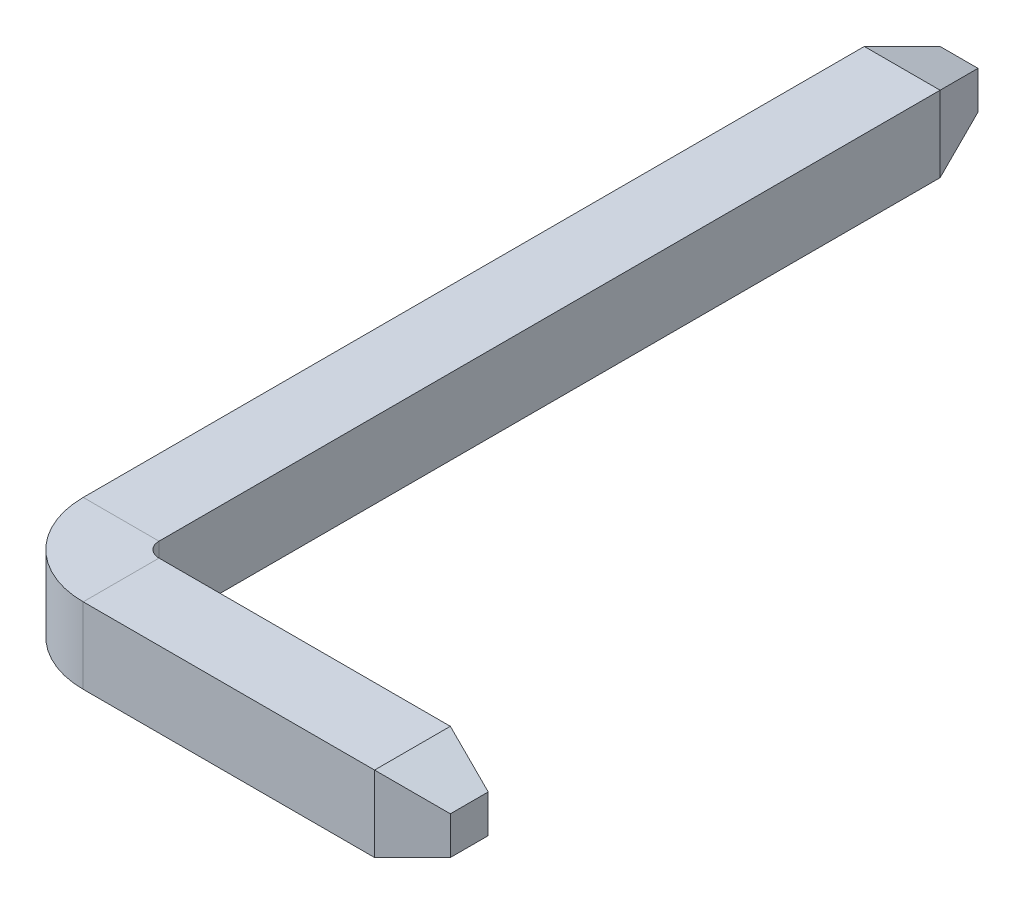
ISO-10303-21;
HEADER;
FILE_DESCRIPTION(('STEP AP214'),'2;1');
FILE_NAME('part.step','',(''),(''),'','','');
FILE_SCHEMA(('AUTOMOTIVE_DESIGN { 1 0 10303 214 1 1 1 1 }'));
ENDSEC;
DATA;
#1=APPLICATION_CONTEXT('core data for automotive mechanical design processes');
#2=APPLICATION_PROTOCOL_DEFINITION('international standard','automotive_design',2000,#1);
#3=PRODUCT_CONTEXT('',#1,'mechanical');
#4=PRODUCT('Part','Part','',(#3));
#5=PRODUCT_RELATED_PRODUCT_CATEGORY('part','',(#4));
#6=PRODUCT_DEFINITION_FORMATION('','',#4);
#7=PRODUCT_DEFINITION_CONTEXT('part definition',#1,'design');
#8=PRODUCT_DEFINITION('design','',#6,#7);
#9=PRODUCT_DEFINITION_SHAPE('','',#8);
#10=(LENGTH_UNIT() NAMED_UNIT(*) SI_UNIT(.MILLI.,.METRE.));
#11=(NAMED_UNIT(*) PLANE_ANGLE_UNIT() SI_UNIT($,.RADIAN.));
#12=(NAMED_UNIT(*) SI_UNIT($,.STERADIAN.) SOLID_ANGLE_UNIT());
#13=UNCERTAINTY_MEASURE_WITH_UNIT(LENGTH_MEASURE(1.E-05),#10,'distance_accuracy_value','');
#14=(GEOMETRIC_REPRESENTATION_CONTEXT(3) GLOBAL_UNCERTAINTY_ASSIGNED_CONTEXT((#13)) GLOBAL_UNIT_ASSIGNED_CONTEXT((#10,
#11,#12)) REPRESENTATION_CONTEXT('',''));
#15=CARTESIAN_POINT('',(0.,0.,0.));
#16=DIRECTION('',(0.,0.,1.));
#17=DIRECTION('',(1.,0.,0.));
#18=AXIS2_PLACEMENT_3D('',#15,#16,#17);
#19=CARTESIAN_POINT('',(0.4773820618069,-0.2,0.));
#20=DIRECTION('',(0.,0.,1.));
#21=DIRECTION('',(1.,0.,0.));
#22=AXIS2_PLACEMENT_3D('',#19,#20,#21);
#23=PLANE('',#22);
#24=DIRECTION('',(1.,0.,0.));
#25=VECTOR('',#24,1.);
#26=CARTESIAN_POINT('',(0.4773820618069,0.2,0.));
#27=LINE('',#26,#25);
#28=CARTESIAN_POINT('',(0.4773820618069,0.2,0.));
#29=VERTEX_POINT('',#28);
#30=CARTESIAN_POINT('',(2.015,0.2,0.));
#31=VERTEX_POINT('',#30);
#32=EDGE_CURVE('E11',#29,#31,#27,.T.);
#33=ORIENTED_EDGE('',*,*,#32,.F.);
#34=DIRECTION('',(0.,1.,0.));
#35=VECTOR('',#34,1.);
#36=CARTESIAN_POINT('',(0.4773820618069,-0.2,0.));
#37=LINE('',#36,#35);
#38=CARTESIAN_POINT('',(0.4773820618069,-0.2,0.));
#39=VERTEX_POINT('',#38);
#40=EDGE_CURVE('E24',#39,#29,#37,.T.);
#41=ORIENTED_EDGE('',*,*,#40,.F.);
#42=DIRECTION('',(1.,0.,0.));
#43=VECTOR('',#42,1.);
#44=CARTESIAN_POINT('',(0.4773820618069,-0.2,0.));
#45=LINE('',#44,#43);
#46=CARTESIAN_POINT('',(2.015,-0.2,0.));
#47=VERTEX_POINT('',#46);
#48=EDGE_CURVE('E232',#39,#47,#45,.T.);
#49=ORIENTED_EDGE('',*,*,#48,.T.);
#50=DIRECTION('',(0.,-1.,0.));
#51=VECTOR('',#50,1.);
#52=CARTESIAN_POINT('',(2.015,0.2,0.));
#53=LINE('',#52,#51);
#54=EDGE_CURVE('E37',#31,#47,#53,.T.);
#55=ORIENTED_EDGE('',*,*,#54,.F.);
#56=EDGE_LOOP('',(#33,#41,#49,#55));
#57=FACE_BOUND('',#56,.T.);
#58=ADVANCED_FACE('F17',(#57),#23,.T.);
#59=CARTESIAN_POINT('',(2.165,0.,-0.05));
#60=DIRECTION('',(0.316227766016808,0.,0.948683298050524));
#61=DIRECTION('',(0.,-1.,0.));
#62=AXIS2_PLACEMENT_3D('',#59,#60,#61);
#63=PLANE('',#62);
#64=DIRECTION('',(-0.904534033733273,-0.301511344577791,0.301511344577791));
#65=VECTOR('',#64,1.);
#66=CARTESIAN_POINT('',(2.315,-0.1,-0.1));
#67=LINE('',#66,#65);
#68=CARTESIAN_POINT('',(2.315,-0.1,-0.1));
#69=VERTEX_POINT('',#68);
#70=EDGE_CURVE('E228',#69,#47,#67,.T.);
#71=ORIENTED_EDGE('',*,*,#70,.F.);
#72=DIRECTION('',(0.,-1.,0.));
#73=VECTOR('',#72,1.);
#74=CARTESIAN_POINT('',(2.315,0.1,-0.1));
#75=LINE('',#74,#73);
#76=CARTESIAN_POINT('',(2.315,0.1,-0.1));
#77=VERTEX_POINT('',#76);
#78=EDGE_CURVE('E226',#77,#69,#75,.T.);
#79=ORIENTED_EDGE('',*,*,#78,.F.);
#80=DIRECTION('',(-0.904534033733273,0.301511344577791,0.301511344577791));
#81=VECTOR('',#80,1.);
#82=CARTESIAN_POINT('',(2.315,0.1,-0.1));
#83=LINE('',#82,#81);
#84=EDGE_CURVE('E223',#77,#31,#83,.T.);
#85=ORIENTED_EDGE('',*,*,#84,.T.);
#86=ORIENTED_EDGE('',*,*,#54,.T.);
#87=EDGE_LOOP('',(#71,#79,#85,#86));
#88=FACE_BOUND('',#87,.T.);
#89=ADVANCED_FACE('F252',(#88),#63,.T.);
#90=CARTESIAN_POINT('',(2.165,0.15,-0.2));
#91=DIRECTION('',(0.316227766016808,0.948683298050524,0.));
#92=DIRECTION('',(0.,0.,-1.));
#93=AXIS2_PLACEMENT_3D('',#90,#91,#92);
#94=PLANE('',#93);
#95=DIRECTION('',(-0.904534033733273,0.301511344577791,-0.301511344577791));
#96=VECTOR('',#95,1.);
#97=CARTESIAN_POINT('',(2.315,0.1,-0.3));
#98=LINE('',#97,#96);
#99=CARTESIAN_POINT('',(2.315,0.1,-0.3));
#100=VERTEX_POINT('',#99);
#101=CARTESIAN_POINT('',(2.015,0.2,-0.4));
#102=VERTEX_POINT('',#101);
#103=EDGE_CURVE('E220',#100,#102,#98,.T.);
#104=ORIENTED_EDGE('',*,*,#103,.T.);
#105=DIRECTION('',(0.,0.,1.));
#106=VECTOR('',#105,1.);
#107=CARTESIAN_POINT('',(2.015,0.2,-0.4));
#108=LINE('',#107,#106);
#109=EDGE_CURVE('E217',#102,#31,#108,.T.);
#110=ORIENTED_EDGE('',*,*,#109,.T.);
#111=ORIENTED_EDGE('',*,*,#84,.F.);
#112=DIRECTION('',(0.,0.,1.));
#113=VECTOR('',#112,1.);
#114=CARTESIAN_POINT('',(2.315,0.1,-0.3));
#115=LINE('',#114,#113);
#116=EDGE_CURVE('E214',#100,#77,#115,.T.);
#117=ORIENTED_EDGE('',*,*,#116,.F.);
#118=EDGE_LOOP('',(#104,#110,#111,#117));
#119=FACE_BOUND('',#118,.T.);
#120=ADVANCED_FACE('F254',(#119),#94,.T.);
#121=CARTESIAN_POINT('',(2.315,0.,-0.2));
#122=DIRECTION('',(1.,0.,0.));
#123=DIRECTION('',(0.,1.,0.));
#124=AXIS2_PLACEMENT_3D('',#121,#122,#123);
#125=PLANE('',#124);
#126=ORIENTED_EDGE('',*,*,#78,.T.);
#127=DIRECTION('',(0.,0.,1.));
#128=VECTOR('',#127,1.);
#129=CARTESIAN_POINT('',(2.315,-0.1,-0.3));
#130=LINE('',#129,#128);
#131=CARTESIAN_POINT('',(2.315,-0.1,-0.3));
#132=VERTEX_POINT('',#131);
#133=EDGE_CURVE('E211',#132,#69,#130,.T.);
#134=ORIENTED_EDGE('',*,*,#133,.F.);
#135=DIRECTION('',(0.,1.,0.));
#136=VECTOR('',#135,1.);
#137=CARTESIAN_POINT('',(2.315,-0.1,-0.3));
#138=LINE('',#137,#136);
#139=EDGE_CURVE('E208',#132,#100,#138,.T.);
#140=ORIENTED_EDGE('',*,*,#139,.T.);
#141=ORIENTED_EDGE('',*,*,#116,.T.);
#142=EDGE_LOOP('',(#126,#134,#140,#141));
#143=FACE_BOUND('',#142,.T.);
#144=ADVANCED_FACE('F251',(#143),#125,.T.);
#145=CARTESIAN_POINT('',(2.165,0.,-0.35));
#146=DIRECTION('',(0.316227766016808,0.,-0.948683298050524));
#147=DIRECTION('',(0.,-1.,0.));
#148=AXIS2_PLACEMENT_3D('',#145,#146,#147);
#149=PLANE('',#148);
#150=ORIENTED_EDGE('',*,*,#103,.F.);
#151=ORIENTED_EDGE('',*,*,#139,.F.);
#152=DIRECTION('',(-0.904534033733273,-0.301511344577791,-0.301511344577791));
#153=VECTOR('',#152,1.);
#154=CARTESIAN_POINT('',(2.315,-0.1,-0.3));
#155=LINE('',#154,#153);
#156=CARTESIAN_POINT('',(2.015,-0.2,-0.4));
#157=VERTEX_POINT('',#156);
#158=EDGE_CURVE('E205',#132,#157,#155,.T.);
#159=ORIENTED_EDGE('',*,*,#158,.T.);
#160=DIRECTION('',(0.,1.,0.));
#161=VECTOR('',#160,1.);
#162=CARTESIAN_POINT('',(2.015,-0.2,-0.4));
#163=LINE('',#162,#161);
#164=EDGE_CURVE('E202',#157,#102,#163,.T.);
#165=ORIENTED_EDGE('',*,*,#164,.T.);
#166=EDGE_LOOP('',(#150,#151,#159,#165));
#167=FACE_BOUND('',#166,.T.);
#168=ADVANCED_FACE('F249',(#167),#149,.T.);
#169=CARTESIAN_POINT('',(0.4773820618069,-0.2,-0.4));
#170=DIRECTION('',(0.,0.,1.));
#171=DIRECTION('',(1.,0.,0.));
#172=AXIS2_PLACEMENT_3D('',#169,#170,#171);
#173=PLANE('',#172);
#174=DIRECTION('',(1.,0.,0.));
#175=VECTOR('',#174,1.);
#176=CARTESIAN_POINT('',(0.4773820618069,-0.2,-0.4));
#177=LINE('',#176,#175);
#178=CARTESIAN_POINT('',(0.4773820618069,-0.2,-0.4));
#179=VERTEX_POINT('',#178);
#180=EDGE_CURVE('E199',#179,#157,#177,.T.);
#181=ORIENTED_EDGE('',*,*,#180,.F.);
#182=DIRECTION('',(0.,1.,0.));
#183=VECTOR('',#182,1.);
#184=CARTESIAN_POINT('',(0.4773820618069,-0.2,-0.4));
#185=LINE('',#184,#183);
#186=CARTESIAN_POINT('',(0.4773820618069,0.2,-0.4));
#187=VERTEX_POINT('',#186);
#188=EDGE_CURVE('E196',#179,#187,#185,.T.);
#189=ORIENTED_EDGE('',*,*,#188,.T.);
#190=DIRECTION('',(1.,0.,0.));
#191=VECTOR('',#190,1.);
#192=CARTESIAN_POINT('',(0.4773820618069,0.2,-0.4));
#193=LINE('',#192,#191);
#194=EDGE_CURVE('E193',#187,#102,#193,.T.);
#195=ORIENTED_EDGE('',*,*,#194,.T.);
#196=ORIENTED_EDGE('',*,*,#164,.F.);
#197=EDGE_LOOP('',(#181,#189,#195,#196));
#198=FACE_BOUND('',#197,.T.);
#199=ADVANCED_FACE('F246',(#198),#173,.F.);
#200=CARTESIAN_POINT('',(1.396191030903,0.2,-0.2));
#201=DIRECTION('',(0.,-1.,0.));
#202=DIRECTION('',(1.,0.,0.));
#203=AXIS2_PLACEMENT_3D('',#200,#201,#202);
#204=PLANE('',#203);
#205=ORIENTED_EDGE('',*,*,#194,.F.);
#206=DIRECTION('',(0.,0.,-1.));
#207=VECTOR('',#206,1.);
#208=CARTESIAN_POINT('',(0.4773820618069,0.2,0.));
#209=LINE('',#208,#207);
#210=EDGE_CURVE('E190',#29,#187,#209,.T.);
#211=ORIENTED_EDGE('',*,*,#210,.F.);
#212=ORIENTED_EDGE('',*,*,#32,.T.);
#213=ORIENTED_EDGE('',*,*,#109,.F.);
#214=EDGE_LOOP('',(#205,#211,#212,#213));
#215=FACE_BOUND('',#214,.T.);
#216=ADVANCED_FACE('F256',(#215),#204,.F.);
#217=CARTESIAN_POINT('',(0.2812433249237,0.2,-0.2812433249237));
#218=DIRECTION('',(0.,-1.,0.));
#219=DIRECTION('',(0.,0.,1.));
#220=AXIS2_PLACEMENT_3D('',#217,#218,#219);
#221=PLANE('',#220);
#222=ORIENTED_EDGE('',*,*,#210,.T.);
#223=CARTESIAN_POINT('',(0.4773820618069,0.2,-0.4773820618069));
#224=DIRECTION('',(0.,1.,0.));
#225=DIRECTION('',(-1.,0.,0.));
#226=AXIS2_PLACEMENT_3D('',#223,#224,#225);
#227=CIRCLE('',#226,0.07738206180687);
#228=CARTESIAN_POINT('',(0.4,0.2,-0.4773820618069));
#229=VERTEX_POINT('',#228);
#230=EDGE_CURVE('E187',#229,#187,#227,.T.);
#231=ORIENTED_EDGE('',*,*,#230,.F.);
#232=DIRECTION('',(1.,0.,0.));
#233=VECTOR('',#232,1.);
#234=CARTESIAN_POINT('',(0.,0.2,-0.4773820618069));
#235=LINE('',#234,#233);
#236=CARTESIAN_POINT('',(0.,0.2,-0.4773820618069));
#237=VERTEX_POINT('',#236);
#238=EDGE_CURVE('E185',#237,#229,#235,.T.);
#239=ORIENTED_EDGE('',*,*,#238,.F.);
#240=CARTESIAN_POINT('',(0.4773820618069,0.2,-0.4773820618069));
#241=DIRECTION('',(0.,1.,0.));
#242=DIRECTION('',(-1.,0.,0.));
#243=AXIS2_PLACEMENT_3D('',#240,#241,#242);
#244=CIRCLE('',#243,0.4773820618069);
#245=EDGE_CURVE('E182',#237,#29,#244,.T.);
#246=ORIENTED_EDGE('',*,*,#245,.T.);
#247=EDGE_LOOP('',(#222,#231,#239,#246));
#248=FACE_BOUND('',#247,.T.);
#249=ADVANCED_FACE('F261',(#248),#221,.F.);
#250=CARTESIAN_POINT('',(0.4773820618069,-0.2,-0.4773820618069));
#251=DIRECTION('',(0.,1.,0.));
#252=DIRECTION('',(1.,0.,0.));
#253=AXIS2_PLACEMENT_3D('',#250,#251,#252);
#254=CYLINDRICAL_SURFACE('',#253,0.4773820618069);
#255=ORIENTED_EDGE('',*,*,#40,.T.);
#256=ORIENTED_EDGE('',*,*,#245,.F.);
#257=DIRECTION('',(0.,1.,0.));
#258=VECTOR('',#257,1.);
#259=CARTESIAN_POINT('',(0.,-0.2,-0.4773820618069));
#260=LINE('',#259,#258);
#261=CARTESIAN_POINT('',(0.,-0.2,-0.4773820618069));
#262=VERTEX_POINT('',#261);
#263=EDGE_CURVE('E180',#262,#237,#260,.T.);
#264=ORIENTED_EDGE('',*,*,#263,.F.);
#265=CARTESIAN_POINT('',(0.4773820618069,-0.2,-0.4773820618069));
#266=DIRECTION('',(0.,1.,0.));
#267=DIRECTION('',(-1.,0.,0.));
#268=AXIS2_PLACEMENT_3D('',#265,#266,#267);
#269=CIRCLE('',#268,0.4773820618069);
#270=EDGE_CURVE('E178',#262,#39,#269,.T.);
#271=ORIENTED_EDGE('',*,*,#270,.T.);
#272=EDGE_LOOP('',(#255,#256,#264,#271));
#273=FACE_BOUND('',#272,.T.);
#274=ADVANCED_FACE('F262',(#273),#254,.T.);
#275=CARTESIAN_POINT('',(0.2812433249237,-0.2,-0.2812433249237));
#276=DIRECTION('',(0.,-1.,0.));
#277=DIRECTION('',(0.,0.,1.));
#278=AXIS2_PLACEMENT_3D('',#275,#276,#277);
#279=PLANE('',#278);
#280=DIRECTION('',(1.,0.,0.));
#281=VECTOR('',#280,1.);
#282=CARTESIAN_POINT('',(0.,-0.2,-0.4773820618069));
#283=LINE('',#282,#281);
#284=CARTESIAN_POINT('',(0.4,-0.2,-0.4773820618069));
#285=VERTEX_POINT('',#284);
#286=EDGE_CURVE('E125',#262,#285,#283,.T.);
#287=ORIENTED_EDGE('',*,*,#286,.T.);
#288=CARTESIAN_POINT('',(0.4773820618069,-0.2,-0.4773820618069));
#289=DIRECTION('',(0.,1.,0.));
#290=DIRECTION('',(-1.,0.,0.));
#291=AXIS2_PLACEMENT_3D('',#288,#289,#290);
#292=CIRCLE('',#291,0.07738206180687);
#293=EDGE_CURVE('E174',#285,#179,#292,.T.);
#294=ORIENTED_EDGE('',*,*,#293,.T.);
#295=DIRECTION('',(0.,0.,-1.));
#296=VECTOR('',#295,1.);
#297=CARTESIAN_POINT('',(0.4773820618069,-0.2,0.));
#298=LINE('',#297,#296);
#299=EDGE_CURVE('E171',#39,#179,#298,.T.);
#300=ORIENTED_EDGE('',*,*,#299,.F.);
#301=ORIENTED_EDGE('',*,*,#270,.F.);
#302=EDGE_LOOP('',(#287,#294,#300,#301));
#303=FACE_BOUND('',#302,.T.);
#304=ADVANCED_FACE('F265',(#303),#279,.T.);
#305=CARTESIAN_POINT('',(1.396191030903,-0.2,-0.2));
#306=DIRECTION('',(0.,-1.,0.));
#307=DIRECTION('',(1.,0.,0.));
#308=AXIS2_PLACEMENT_3D('',#305,#306,#307);
#309=PLANE('',#308);
#310=ORIENTED_EDGE('',*,*,#48,.F.);
#311=ORIENTED_EDGE('',*,*,#299,.T.);
#312=ORIENTED_EDGE('',*,*,#180,.T.);
#313=DIRECTION('',(0.,0.,1.));
#314=VECTOR('',#313,1.);
#315=CARTESIAN_POINT('',(2.015,-0.2,-0.4));
#316=LINE('',#315,#314);
#317=EDGE_CURVE('E168',#157,#47,#316,.T.);
#318=ORIENTED_EDGE('',*,*,#317,.T.);
#319=EDGE_LOOP('',(#310,#311,#312,#318));
#320=FACE_BOUND('',#319,.T.);
#321=ADVANCED_FACE('F242',(#320),#309,.T.);
#322=CARTESIAN_POINT('',(2.165,-0.15,-0.2));
#323=DIRECTION('',(0.316227766016808,-0.948683298050524,0.));
#324=DIRECTION('',(0.,0.,-1.));
#325=AXIS2_PLACEMENT_3D('',#322,#323,#324);
#326=PLANE('',#325);
#327=ORIENTED_EDGE('',*,*,#158,.F.);
#328=ORIENTED_EDGE('',*,*,#133,.T.);
#329=ORIENTED_EDGE('',*,*,#70,.T.);
#330=ORIENTED_EDGE('',*,*,#317,.F.);
#331=EDGE_LOOP('',(#327,#328,#329,#330));
#332=FACE_BOUND('',#331,.T.);
#333=ADVANCED_FACE('F238',(#332),#326,.T.);
#334=CARTESIAN_POINT('',(0.4773820618069,-0.2,-0.4773820618069));
#335=DIRECTION('',(0.,1.,0.));
#336=DIRECTION('',(1.,0.,0.));
#337=AXIS2_PLACEMENT_3D('',#334,#335,#336);
#338=CYLINDRICAL_SURFACE('',#337,0.07738206180687);
#339=DIRECTION('',(0.,1.,0.));
#340=VECTOR('',#339,1.);
#341=CARTESIAN_POINT('',(0.4,-0.2,-0.4773820618069));
#342=LINE('',#341,#340);
#343=EDGE_CURVE('E165',#285,#229,#342,.T.);
#344=ORIENTED_EDGE('',*,*,#343,.T.);
#345=ORIENTED_EDGE('',*,*,#230,.T.);
#346=ORIENTED_EDGE('',*,*,#188,.F.);
#347=ORIENTED_EDGE('',*,*,#293,.F.);
#348=EDGE_LOOP('',(#344,#345,#346,#347));
#349=FACE_BOUND('',#348,.T.);
#350=ADVANCED_FACE('F268',(#349),#338,.F.);
#351=CARTESIAN_POINT('',(0.4,-0.2,-4.9));
#352=DIRECTION('',(-1.,0.,0.));
#353=DIRECTION('',(0.,0.,1.));
#354=AXIS2_PLACEMENT_3D('',#351,#352,#353);
#355=PLANE('',#354);
#356=DIRECTION('',(0.,0.,1.));
#357=VECTOR('',#356,1.);
#358=CARTESIAN_POINT('',(0.4,0.2,-4.6));
#359=LINE('',#358,#357);
#360=CARTESIAN_POINT('',(0.4,0.2,-4.6));
#361=VERTEX_POINT('',#360);
#362=EDGE_CURVE('E162',#361,#229,#359,.T.);
#363=ORIENTED_EDGE('',*,*,#362,.T.);
#364=ORIENTED_EDGE('',*,*,#343,.F.);
#365=DIRECTION('',(0.,0.,1.));
#366=VECTOR('',#365,1.);
#367=CARTESIAN_POINT('',(0.4,-0.2,-4.6));
#368=LINE('',#367,#366);
#369=CARTESIAN_POINT('',(0.4,-0.2,-4.6));
#370=VERTEX_POINT('',#369);
#371=EDGE_CURVE('E160',#370,#285,#368,.T.);
#372=ORIENTED_EDGE('',*,*,#371,.F.);
#373=DIRECTION('',(0.,1.,0.));
#374=VECTOR('',#373,1.);
#375=CARTESIAN_POINT('',(0.4,-0.2,-4.6));
#376=LINE('',#375,#374);
#377=EDGE_CURVE('E158',#370,#361,#376,.T.);
#378=ORIENTED_EDGE('',*,*,#377,.T.);
#379=EDGE_LOOP('',(#363,#364,#372,#378));
#380=FACE_BOUND('',#379,.T.);
#381=ADVANCED_FACE('F272',(#380),#355,.F.);
#382=CARTESIAN_POINT('',(0.35,0.,-4.75));
#383=DIRECTION('',(0.948683298050524,0.,-0.316227766016808));
#384=DIRECTION('',(0.,-1.,0.));
#385=AXIS2_PLACEMENT_3D('',#382,#383,#384);
#386=PLANE('',#385);
#387=DIRECTION('',(-0.301511344577791,-0.301511344577791,-0.904534033733273));
#388=VECTOR('',#387,1.);
#389=CARTESIAN_POINT('',(0.4,0.2,-4.6));
#390=LINE('',#389,#388);
#391=CARTESIAN_POINT('',(0.3,0.1,-4.9));
#392=VERTEX_POINT('',#391);
#393=EDGE_CURVE('E155',#361,#392,#390,.T.);
#394=ORIENTED_EDGE('',*,*,#393,.F.);
#395=ORIENTED_EDGE('',*,*,#377,.F.);
#396=DIRECTION('',(0.301511344577791,-0.301511344577791,0.904534033733273));
#397=VECTOR('',#396,1.);
#398=CARTESIAN_POINT('',(0.3,-0.1,-4.9));
#399=LINE('',#398,#397);
#400=CARTESIAN_POINT('',(0.3,-0.1,-4.9));
#401=VERTEX_POINT('',#400);
#402=EDGE_CURVE('E138',#401,#370,#399,.T.);
#403=ORIENTED_EDGE('',*,*,#402,.F.);
#404=DIRECTION('',(0.,1.,0.));
#405=VECTOR('',#404,1.);
#406=CARTESIAN_POINT('',(0.3,-0.1,-4.9));
#407=LINE('',#406,#405);
#408=EDGE_CURVE('E152',#401,#392,#407,.T.);
#409=ORIENTED_EDGE('',*,*,#408,.T.);
#410=EDGE_LOOP('',(#394,#395,#403,#409));
#411=FACE_BOUND('',#410,.T.);
#412=ADVANCED_FACE('F278',(#411),#386,.T.);
#413=CARTESIAN_POINT('',(0.2,0.,-4.9));
#414=DIRECTION('',(0.,0.,1.));
#415=DIRECTION('',(0.,1.,0.));
#416=AXIS2_PLACEMENT_3D('',#413,#414,#415);
#417=PLANE('',#416);
#418=ORIENTED_EDGE('',*,*,#408,.F.);
#419=DIRECTION('',(-1.,0.,0.));
#420=VECTOR('',#419,1.);
#421=CARTESIAN_POINT('',(0.3,-0.1,-4.9));
#422=LINE('',#421,#420);
#423=CARTESIAN_POINT('',(0.1,-0.1,-4.9));
#424=VERTEX_POINT('',#423);
#425=EDGE_CURVE('E150',#401,#424,#422,.T.);
#426=ORIENTED_EDGE('',*,*,#425,.T.);
#427=DIRECTION('',(0.,-1.,0.));
#428=VECTOR('',#427,1.);
#429=CARTESIAN_POINT('',(0.1,0.1,-4.9));
#430=LINE('',#429,#428);
#431=CARTESIAN_POINT('',(0.1,0.1,-4.9));
#432=VERTEX_POINT('',#431);
#433=EDGE_CURVE('E130',#432,#424,#430,.T.);
#434=ORIENTED_EDGE('',*,*,#433,.F.);
#435=DIRECTION('',(-1.,0.,0.));
#436=VECTOR('',#435,1.);
#437=CARTESIAN_POINT('',(0.3,0.1,-4.9));
#438=LINE('',#437,#436);
#439=EDGE_CURVE('E147',#392,#432,#438,.T.);
#440=ORIENTED_EDGE('',*,*,#439,.F.);
#441=EDGE_LOOP('',(#418,#426,#434,#440));
#442=FACE_BOUND('',#441,.T.);
#443=ADVANCED_FACE('F283',(#442),#417,.F.);
#444=CARTESIAN_POINT('',(0.2,0.15,-4.75));
#445=DIRECTION('',(0.,0.948683298050524,-0.316227766016808));
#446=DIRECTION('',(-1.,0.,0.));
#447=AXIS2_PLACEMENT_3D('',#444,#445,#446);
#448=PLANE('',#447);
#449=ORIENTED_EDGE('',*,*,#393,.T.);
#450=ORIENTED_EDGE('',*,*,#439,.T.);
#451=DIRECTION('',(-0.301511344577791,0.301511344577791,0.904534033733273));
#452=VECTOR('',#451,1.);
#453=CARTESIAN_POINT('',(0.1,0.1,-4.9));
#454=LINE('',#453,#452);
#455=CARTESIAN_POINT('',(0.,0.2,-4.6));
#456=VERTEX_POINT('',#455);
#457=EDGE_CURVE('E144',#432,#456,#454,.T.);
#458=ORIENTED_EDGE('',*,*,#457,.T.);
#459=DIRECTION('',(-1.,0.,0.));
#460=VECTOR('',#459,1.);
#461=CARTESIAN_POINT('',(0.4,0.2,-4.6));
#462=LINE('',#461,#460);
#463=EDGE_CURVE('E142',#361,#456,#462,.T.);
#464=ORIENTED_EDGE('',*,*,#463,.F.);
#465=EDGE_LOOP('',(#449,#450,#458,#464));
#466=FACE_BOUND('',#465,.T.);
#467=ADVANCED_FACE('F281',(#466),#448,.T.);
#468=CARTESIAN_POINT('',(0.2,0.2,-2.688691030903));
#469=DIRECTION('',(0.,-1.,0.));
#470=DIRECTION('',(0.,0.,1.));
#471=AXIS2_PLACEMENT_3D('',#468,#469,#470);
#472=PLANE('',#471);
#473=DIRECTION('',(0.,0.,1.));
#474=VECTOR('',#473,1.);
#475=CARTESIAN_POINT('',(0.,0.2,-4.6));
#476=LINE('',#475,#474);
#477=EDGE_CURVE('E111',#456,#237,#476,.T.);
#478=ORIENTED_EDGE('',*,*,#477,.T.);
#479=ORIENTED_EDGE('',*,*,#238,.T.);
#480=ORIENTED_EDGE('',*,*,#362,.F.);
#481=ORIENTED_EDGE('',*,*,#463,.T.);
#482=EDGE_LOOP('',(#478,#479,#480,#481));
#483=FACE_BOUND('',#482,.T.);
#484=ADVANCED_FACE('F275',(#483),#472,.F.);
#485=CARTESIAN_POINT('',(0.,-0.2,-4.9));
#486=DIRECTION('',(-1.,0.,0.));
#487=DIRECTION('',(0.,0.,1.));
#488=AXIS2_PLACEMENT_3D('',#485,#486,#487);
#489=PLANE('',#488);
#490=DIRECTION('',(0.,0.,1.));
#491=VECTOR('',#490,1.);
#492=CARTESIAN_POINT('',(0.,-0.2,-4.6));
#493=LINE('',#492,#491);
#494=CARTESIAN_POINT('',(0.,-0.2,-4.6));
#495=VERTEX_POINT('',#494);
#496=EDGE_CURVE('E109',#495,#262,#493,.T.);
#497=ORIENTED_EDGE('',*,*,#496,.T.);
#498=ORIENTED_EDGE('',*,*,#263,.T.);
#499=ORIENTED_EDGE('',*,*,#477,.F.);
#500=DIRECTION('',(0.,-1.,0.));
#501=VECTOR('',#500,1.);
#502=CARTESIAN_POINT('',(0.,0.2,-4.6));
#503=LINE('',#502,#501);
#504=EDGE_CURVE('E105',#456,#495,#503,.T.);
#505=ORIENTED_EDGE('',*,*,#504,.T.);
#506=EDGE_LOOP('',(#497,#498,#499,#505));
#507=FACE_BOUND('',#506,.T.);
#508=ADVANCED_FACE('F107',(#507),#489,.T.);
#509=CARTESIAN_POINT('',(0.05,0.,-4.75));
#510=DIRECTION('',(-0.948683298050524,0.,-0.316227766016808));
#511=DIRECTION('',(0.,-1.,0.));
#512=AXIS2_PLACEMENT_3D('',#509,#510,#511);
#513=PLANE('',#512);
#514=ORIENTED_EDGE('',*,*,#457,.F.);
#515=ORIENTED_EDGE('',*,*,#433,.T.);
#516=DIRECTION('',(-0.301511344577791,-0.301511344577791,0.904534033733273));
#517=VECTOR('',#516,1.);
#518=CARTESIAN_POINT('',(0.1,-0.1,-4.9));
#519=LINE('',#518,#517);
#520=EDGE_CURVE('E115',#424,#495,#519,.T.);
#521=ORIENTED_EDGE('',*,*,#520,.T.);
#522=ORIENTED_EDGE('',*,*,#504,.F.);
#523=EDGE_LOOP('',(#514,#515,#521,#522));
#524=FACE_BOUND('',#523,.T.);
#525=ADVANCED_FACE('F128',(#524),#513,.T.);
#526=CARTESIAN_POINT('',(0.2,-0.15,-4.75));
#527=DIRECTION('',(0.,-0.948683298050524,-0.316227766016808));
#528=DIRECTION('',(-1.,0.,0.));
#529=AXIS2_PLACEMENT_3D('',#526,#527,#528);
#530=PLANE('',#529);
#531=ORIENTED_EDGE('',*,*,#520,.F.);
#532=ORIENTED_EDGE('',*,*,#425,.F.);
#533=ORIENTED_EDGE('',*,*,#402,.T.);
#534=DIRECTION('',(-1.,0.,0.));
#535=VECTOR('',#534,1.);
#536=CARTESIAN_POINT('',(0.4,-0.2,-4.6));
#537=LINE('',#536,#535);
#538=EDGE_CURVE('E123',#370,#495,#537,.T.);
#539=ORIENTED_EDGE('',*,*,#538,.T.);
#540=EDGE_LOOP('',(#531,#532,#533,#539));
#541=FACE_BOUND('',#540,.T.);
#542=ADVANCED_FACE('F136',(#541),#530,.T.);
#543=CARTESIAN_POINT('',(0.2,-0.2,-2.688691030903));
#544=DIRECTION('',(0.,-1.,0.));
#545=DIRECTION('',(0.,0.,1.));
#546=AXIS2_PLACEMENT_3D('',#543,#544,#545);
#547=PLANE('',#546);
#548=ORIENTED_EDGE('',*,*,#371,.T.);
#549=ORIENTED_EDGE('',*,*,#286,.F.);
#550=ORIENTED_EDGE('',*,*,#496,.F.);
#551=ORIENTED_EDGE('',*,*,#538,.F.);
#552=EDGE_LOOP('',(#548,#549,#550,#551));
#553=FACE_BOUND('',#552,.T.);
#554=ADVANCED_FACE('F121',(#553),#547,.T.);
#555=CLOSED_SHELL('',(#58,#89,#120,#144,#168,#199,#216,#249,#274,#304,#321,#333,#350,#381,#412,
#443,#467,#484,#508,#525,#542,#554));
#556=MANIFOLD_SOLID_BREP('B1',#555);
#557=ADVANCED_BREP_SHAPE_REPRESENTATION('',(#18,#556),#14);
#558=SHAPE_DEFINITION_REPRESENTATION(#9,#557);
ENDSEC;
END-ISO-10303-21;
